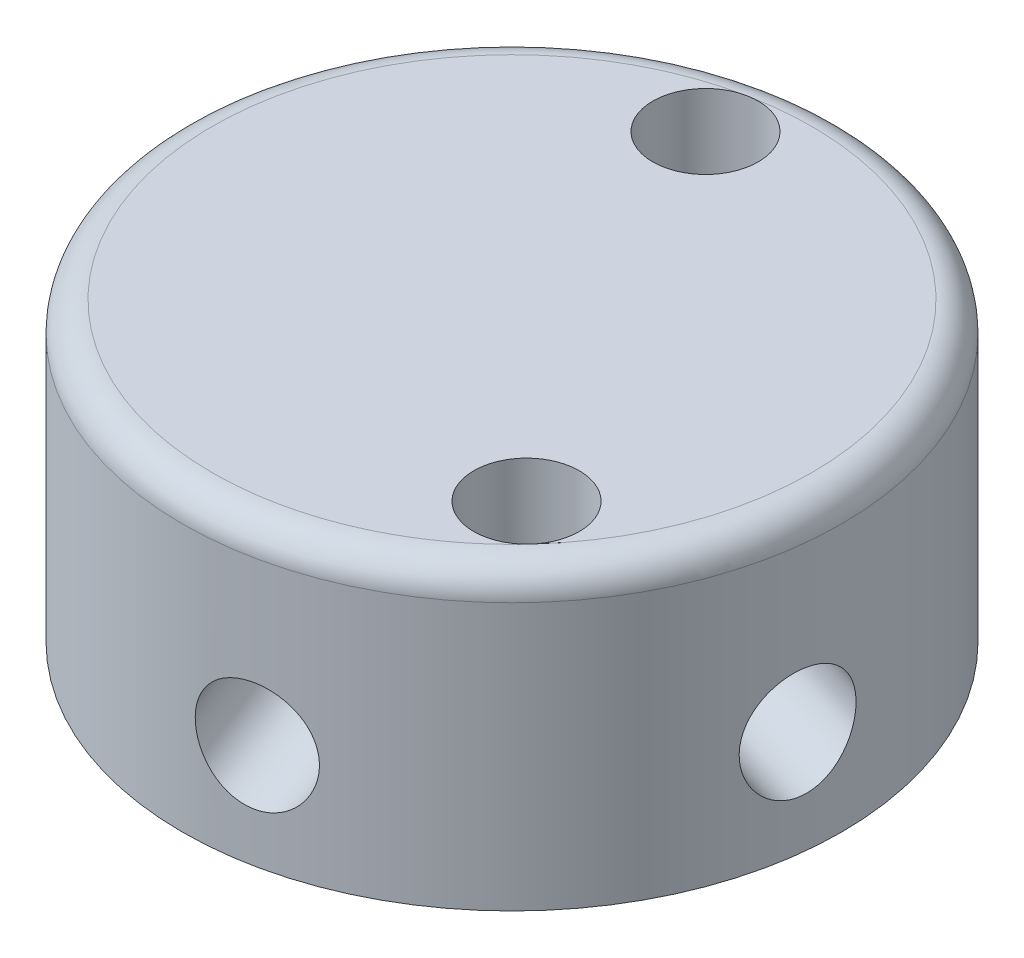
ISO-10303-21;
HEADER;
FILE_DESCRIPTION(('STEP AP214'),'2;1');
FILE_NAME('part.step','',(''),(''),'','','');
FILE_SCHEMA(('AUTOMOTIVE_DESIGN { 1 0 10303 214 1 1 1 1 }'));
ENDSEC;
DATA;
#1=APPLICATION_CONTEXT('core data for automotive mechanical design processes');
#2=APPLICATION_PROTOCOL_DEFINITION('international standard','automotive_design',2000,#1);
#3=PRODUCT_CONTEXT('',#1,'mechanical');
#4=PRODUCT('Part','Part','',(#3));
#5=PRODUCT_RELATED_PRODUCT_CATEGORY('part','',(#4));
#6=PRODUCT_DEFINITION_FORMATION('','',#4);
#7=PRODUCT_DEFINITION_CONTEXT('part definition',#1,'design');
#8=PRODUCT_DEFINITION('design','',#6,#7);
#9=PRODUCT_DEFINITION_SHAPE('','',#8);
#10=(LENGTH_UNIT() NAMED_UNIT(*) SI_UNIT(.MILLI.,.METRE.));
#11=(NAMED_UNIT(*) PLANE_ANGLE_UNIT() SI_UNIT($,.RADIAN.));
#12=(NAMED_UNIT(*) SI_UNIT($,.STERADIAN.) SOLID_ANGLE_UNIT());
#13=UNCERTAINTY_MEASURE_WITH_UNIT(LENGTH_MEASURE(1.E-05),#10,'distance_accuracy_value','');
#14=(GEOMETRIC_REPRESENTATION_CONTEXT(3) GLOBAL_UNCERTAINTY_ASSIGNED_CONTEXT((#13)) GLOBAL_UNIT_ASSIGNED_CONTEXT((#10,
#11,#12)) REPRESENTATION_CONTEXT('',''));
#15=CARTESIAN_POINT('',(0.,0.,0.));
#16=DIRECTION('',(0.,0.,1.));
#17=DIRECTION('',(1.,0.,0.));
#18=AXIS2_PLACEMENT_3D('',#15,#16,#17);
#19=CARTESIAN_POINT('',(0.,-6.,0.));
#20=DIRECTION('',(0.,1.,0.));
#21=DIRECTION('',(0.,0.,1.));
#22=AXIS2_PLACEMENT_3D('',#19,#20,#21);
#23=CYLINDRICAL_SURFACE('',#22,10.);
#24=CARTESIAN_POINT('',(0.,2.1,0.));
#25=DIRECTION('',(0.,1.,0.));
#26=DIRECTION('',(0.,0.,1.));
#27=AXIS2_PLACEMENT_3D('',#24,#25,#26);
#28=CIRCLE('',#27,10.);
#29=CARTESIAN_POINT('',(0.,2.1,10.));
#30=VERTEX_POINT('',#29);
#31=EDGE_CURVE('E12',#30,#30,#28,.F.);
#32=ORIENTED_EDGE('',*,*,#31,.T.);
#33=EDGE_LOOP('',(#32));
#34=FACE_BOUND('',#33,.T.);
#35=CARTESIAN_POINT('',(-6.18040658631982,-2.80419257592395,-7.8614613417465));
#36=CARTESIAN_POINT('',(-6.18041069378116,-2.90234784309518,-7.86145985033207));
#37=CARTESIAN_POINT('',(-6.18709037837394,-3.00057569421897,-7.85622071906424));
#38=CARTESIAN_POINT('',(-6.21328313433534,-3.19429375623175,-7.83552031582612));
#39=CARTESIAN_POINT('',(-6.23281569685475,-3.28977957900091,-7.82004351843738));
#40=CARTESIAN_POINT('',(-6.28376502842835,-3.47517276967888,-7.77916181257504));
#41=CARTESIAN_POINT('',(-6.31516706385408,-3.56508689335964,-7.75376921134334));
#42=CARTESIAN_POINT('',(-6.38865971296323,-3.73693258914234,-7.69332712533847));
#43=CARTESIAN_POINT('',(-6.4307480948599,-3.81886582307326,-7.65827965680337));
#44=CARTESIAN_POINT('',(-6.52448986893661,-3.97278415857681,-7.5785772815116));
#45=CARTESIAN_POINT('',(-6.57620342226979,-4.04470142029659,-7.53386164380033));
#46=CARTESIAN_POINT('',(-6.68725447470501,-4.17534392326118,-7.43546314485651));
#47=CARTESIAN_POINT('',(-6.74659001159406,-4.23407254914793,-7.38178259049963));
#48=CARTESIAN_POINT('',(-6.86747316238743,-4.33309816932697,-7.26940523116863));
#49=CARTESIAN_POINT('',(-6.92874101682425,-4.37420107240322,-7.21111983965897));
#50=CARTESIAN_POINT('',(-7.05399457373656,-4.44028699170343,-7.08863909005609));
#51=CARTESIAN_POINT('',(-7.1179783887015,-4.46528101377072,-7.02444780130276));
#52=CARTESIAN_POINT('',(-7.2408979989159,-4.4964619358335,-6.8975752553002));
#53=CARTESIAN_POINT('',(-7.2998114016746,-4.50403920222909,-6.835211852897));
#54=CARTESIAN_POINT('',(-7.41599656463583,-4.50415740699111,-6.70897494081218));
#55=CARTESIAN_POINT('',(-7.47326875792584,-4.49670234989006,-6.64510183778663));
#56=CARTESIAN_POINT('',(-7.58217917913624,-4.46774917979113,-6.52051620708892));
#57=CARTESIAN_POINT('',(-7.63395240425703,-4.44684381033082,-6.45978210248453));
#58=CARTESIAN_POINT('',(-7.73327325732892,-4.39246364343792,-6.34054506008151));
#59=CARTESIAN_POINT('',(-7.78082040703957,-4.35898742566933,-6.28204237522627));
#60=CARTESIAN_POINT('',(-7.87234067780815,-4.27943950635112,-6.1669959074082));
#61=CARTESIAN_POINT('',(-7.91614456968675,-4.23298937226029,-6.11058005058202));
#62=CARTESIAN_POINT('',(-7.99779809730484,-4.12962391405995,-6.00331398885442));
#63=CARTESIAN_POINT('',(-8.03564580230697,-4.0727052094075,-5.95246559029986));
#64=CARTESIAN_POINT('',(-8.10775604691805,-3.94529584290214,-5.85391396776607));
#65=CARTESIAN_POINT('',(-8.14151429694982,-3.87409566698231,-5.80675887231004));
#66=CARTESIAN_POINT('',(-8.20153607142322,-3.7234916320388,-5.72167140512811));
#67=CARTESIAN_POINT('',(-8.22779684344153,-3.64408477476704,-5.68374242118406));
#68=CARTESIAN_POINT('',(-8.27416487683236,-3.47360706993731,-5.61604816884507));
#69=CARTESIAN_POINT('',(-8.29374975039458,-3.38211206928312,-5.58698947660017));
#70=CARTESIAN_POINT('',(-8.32405447795391,-3.19457090082377,-5.54173833167562));
#71=CARTESIAN_POINT('',(-8.33477322064973,-3.09852416408824,-5.52554749189225));
#72=CARTESIAN_POINT('',(-8.34721005269621,-2.9032972349777,-5.50674303326532));
#73=CARTESIAN_POINT('',(-8.3488141503021,-2.80409289685924,-5.50430137103277));
#74=CARTESIAN_POINT('',(-8.34248086251898,-2.60668729118917,-5.51389588691072));
#75=CARTESIAN_POINT('',(-8.33454554272457,-2.50848581112888,-5.52592893077623));
#76=CARTESIAN_POINT('',(-8.30942286587974,-2.31961542955216,-5.56362998091201));
#77=CARTESIAN_POINT('',(-8.29257179549985,-2.22880300805648,-5.58880197157573));
#78=CARTESIAN_POINT('',(-8.24983112683427,-2.05390062311326,-5.65170093491985));
#79=CARTESIAN_POINT('',(-8.2239437144287,-1.96980903994349,-5.68942487119679));
#80=CARTESIAN_POINT('',(-8.16459239437144,-1.81433058777238,-5.77425211059514));
#81=CARTESIAN_POINT('',(-8.13148151790137,-1.74256485669541,-5.82090888833601));
#82=CARTESIAN_POINT('',(-8.05758249695944,-1.60987893076595,-5.92277904761302));
#83=CARTESIAN_POINT('',(-8.01679522194457,-1.54895750916636,-5.97799145998169));
#84=CARTESIAN_POINT('',(-7.9291356931972,-1.44084866104323,-6.09376440834493));
#85=CARTESIAN_POINT('',(-7.88240129647873,-1.39341115377824,-6.15419605110393));
#86=CARTESIAN_POINT('',(-7.78316118923601,-1.31197818446462,-6.27923276033472));
#87=CARTESIAN_POINT('',(-7.73065563818385,-1.27798235110665,-6.34383771146675));
#88=CARTESIAN_POINT('',(-7.62126393920933,-1.22444215000392,-6.47484261923763));
#89=CARTESIAN_POINT('',(-7.56439461267379,-1.20484509181928,-6.54123510023709));
#90=CARTESIAN_POINT('',(-7.44753128648001,-1.18040665367519,-6.67398645668238));
#91=CARTESIAN_POINT('',(-7.38753727259583,-1.17556534090098,-6.74034533197383));
#92=CARTESIAN_POINT('',(-7.26603697545491,-1.18076540289665,-6.87114840534427));
#93=CARTESIAN_POINT('',(-7.20452970867928,-1.1908167224365,-6.93559129467686));
#94=CARTESIAN_POINT('',(-7.08188582181877,-1.22556046932424,-7.06077720898353));
#95=CARTESIAN_POINT('',(-7.02074920150364,-1.25025288757539,-7.12152023625636));
#96=CARTESIAN_POINT('',(-6.90082161745449,-1.31362986693059,-7.23779262794899));
#97=CARTESIAN_POINT('',(-6.84203053304105,-1.3523137071329,-7.29332226080096));
#98=CARTESIAN_POINT('',(-6.72880950003165,-1.4426321301286,-7.39790984547475));
#99=CARTESIAN_POINT('',(-6.67437928718441,-1.49426592742231,-7.44696818954728));
#100=CARTESIAN_POINT('',(-6.57186287088399,-1.60901583583468,-7.53759282097776));
#101=CARTESIAN_POINT('',(-6.52377217819324,-1.67212374556233,-7.57916441768701));
#102=CARTESIAN_POINT('',(-6.43563400862007,-1.80807329481835,-7.65414747741365));
#103=CARTESIAN_POINT('',(-6.39558808462159,-1.88091680910276,-7.68755736524249));
#104=CARTESIAN_POINT('',(-6.32481099983414,-2.03460274266089,-7.74589484926247));
#105=CARTESIAN_POINT('',(-6.29412611305473,-2.11548235994557,-7.77078037939385));
#106=CARTESIAN_POINT('',(-6.24337632993539,-2.2825764910716,-7.8116145758641));
#107=CARTESIAN_POINT('',(-6.22330160238461,-2.36878598329015,-7.82757151610482));
#108=CARTESIAN_POINT('',(-6.19932412581324,-2.51357139572223,-7.84656075943516));
#109=CARTESIAN_POINT('',(-6.19222425836726,-2.57131759117338,-7.85215871739794));
#110=CARTESIAN_POINT('',(-6.18276429226737,-2.68743149130231,-7.85960943208847));
#111=CARTESIAN_POINT('',(-6.18040414275684,-2.74579918930468,-7.86146222900137));
#112=CARTESIAN_POINT('',(-6.18040658631982,-2.80419257592395,-7.8614613417465));
#113=B_SPLINE_CURVE_WITH_KNOTS('',3,(#35,#36,#37,#38,#39,#40,#41,#42,#43,#44,#45,#46,#47,#48,
#49,#50,#51,#52,#53,#54,#55,#56,#57,#58,#59,#60,#61,#62,#63,#64,#65,#66,#67,#68,#69,#70,#71,#72,
#73,#74,#75,#76,#77,#78,#79,#80,#81,#82,#83,#84,#85,#86,#87,#88,#89,#90,#91,#92,#93,#94,#95,#96,
#97,#98,#99,#100,#101,#102,#103,#104,#105,#106,#107,#108,#109,#110,#111,#112),.UNSPECIFIED.,.T.,
.F.,(4,2,2,2,2,2,2,2,2,2,2,2,2,2,2,2,2,2,2,2,2,2,2,2,2,2,2,2,2,2,2,2,2,2,2,2,2,2,4),(0.,
0.294247369480007,0.588941991186979,0.883272002128368,1.17754059429731,1.47371432417628,
1.76981195895846,2.05036159735739,2.33071935602934,2.58777759553048,2.84476736510533,
3.091142592679,3.33754566570429,3.59206194690359,3.84666056204866,4.12096676141902,
4.39537353311392,4.6879442991612,4.98055173114879,5.27681071896179,5.57300556860702,
5.85875072810492,6.1444268140438,6.41842323334606,6.69238863746758,6.9608803249332,
7.22936459513529,7.49686142113619,7.76435946509044,8.0320362152438,8.29971279908588,
8.56737559297647,8.83502215529133,9.10247815769814,9.36998573770895,9.63879501418435,
9.90735477750061,10.0824068686198,10.2574570814401),.UNSPECIFIED.);
#114=CARTESIAN_POINT('',(-6.18040658631982,-2.80419257592395,-7.8614613417465));
#115=VERTEX_POINT('',#114);
#116=EDGE_CURVE('E86',#115,#115,#113,.T.);
#117=ORIENTED_EDGE('',*,*,#116,.F.);
#118=EDGE_LOOP('',(#117));
#119=FACE_BOUND('',#118,.T.);
#120=CARTESIAN_POINT('',(5.56684336935079,-2.80419257592395,-8.30724111249428));
#121=CARTESIAN_POINT('',(5.56684068165602,-2.90234784309518,-8.30724455804975));
#122=CARTESIAN_POINT('',(5.5597938356678,-3.00057569421897,-8.31197833501099));
#123=CARTESIAN_POINT('',(5.53201257555666,-3.19429375623175,-8.33049234985681));
#124=CARTESIAN_POINT('',(5.51125737278652,-3.28977957900091,-8.34428632730922));
#125=CARTESIAN_POINT('',(5.4566323507206,-3.47517276967888,-8.38010887923268));
#126=CARTESIAN_POINT('',(5.42277878924899,-3.56508689335964,-8.40212724433727));
#127=CARTESIAN_POINT('',(5.34258447195922,-3.73693258914234,-8.45334527542134));
#128=CARTESIAN_POINT('',(5.29624632335746,-3.81886582307326,-8.48254344189732));
#129=CARTESIAN_POINT('',(5.19147705869946,-3.97278415857681,-8.54706777852483));
#130=CARTESIAN_POINT('',(5.13296959325439,-4.04470142029659,-8.58243239843604));
#131=CARTESIAN_POINT('',(5.0050703971945,-4.17534392326118,-8.65764141710136));
#132=CARTESIAN_POINT('',(4.93568146690598,-4.23407254914793,-8.69748466254382));
#133=CARTESIAN_POINT('',(4.79144929910144,-4.33309816932697,-8.77772485699988));
#134=CARTESIAN_POINT('',(4.7170837894715,-4.37420107240322,-8.81798287270117));
#135=CARTESIAN_POINT('',(4.56189219674915,-4.44028699170343,-8.89925745108069));
#136=CARTESIAN_POINT('',(4.48107056710181,-4.46528101377072,-8.94027347612491));
#137=CARTESIAN_POINT('',(4.32242335698893,-4.4964619358335,-9.01797119956537));
#138=CARTESIAN_POINT('',(4.24490699410614,-4.50403920222909,-9.05472982398652));
#139=CARTESIAN_POINT('',(4.08894536642164,-4.50415740699111,-9.12621912916599));
#140=CARTESIAN_POINT('',(4.01050035454146,-4.49670234989006,-9.16095034747861));
#141=CARTESIAN_POINT('',(3.85835720761111,-4.46774917979113,-9.2260312361227));
#142=CARTESIAN_POINT('',(3.78459683524983,-4.44684381033082,-9.25650262878254));
#143=CARTESIAN_POINT('',(3.64050383759365,-4.39246364343792,-9.31411610083902));
#144=CARTESIAN_POINT('',(3.57017160064663,-4.35898742566933,-9.34125780356576));
#145=CARTESIAN_POINT('',(3.43247458875423,-4.27943950635112,-9.39274743975472));
#146=CARTESIAN_POINT('',(3.36528377348706,-4.23298937226029,-9.41697395805344));
#147=CARTESIAN_POINT('',(3.23803535881906,-4.12962391405995,-9.46148404157961));
#148=CARTESIAN_POINT('',(3.17798007398682,-4.0727052094075,-9.48176632875859));
#149=CARTESIAN_POINT('',(3.06196862013124,-3.94529584290214,-9.51989312060143));
#150=CARTESIAN_POINT('',(3.00668958636109,-3.87409566698231,-9.53742739840558));
#151=CARTESIAN_POINT('',(2.90721884789784,-3.7234916320388,-9.56821802477057));
#152=CARTESIAN_POINT('',(2.86303121572234,-3.64408477476704,-9.58147280250344));
#153=CARTESIAN_POINT('',(2.78432164560611,-3.47360706993731,-9.60465274841332));
#154=CARTESIAN_POINT('',(2.75063312822817,-3.38211206928312,-9.61429944029751));
#155=CARTESIAN_POINT('',(2.69823205615212,-3.19457090082377,-9.62913757612075));
#156=CARTESIAN_POINT('',(2.67952137882051,-3.09852416408824,-9.63432846156183));
#157=CARTESIAN_POINT('',(2.65779408344942,-2.9032972349777,-9.64034569443597));
#158=CARTESIAN_POINT('',(2.6549762312517,-2.80409289685924,-9.64111676679244));
#159=CARTESIAN_POINT('',(2.66605825165337,-2.60668729118918,-9.63805832063582));
#160=CARTESIAN_POINT('',(2.67995450510481,-2.50848581112888,-9.63422979808496));
#161=CARTESIAN_POINT('',(2.72357366859686,-2.31961542955216,-9.62198697776265));
#162=CARTESIAN_POINT('',(2.7527209214665,-2.22880300805648,-9.61373923036864));
#163=CARTESIAN_POINT('',(2.82574898339175,-2.05390062311326,-9.59252728752533));
#164=CARTESIAN_POINT('',(2.86962622918195,-1.96980903994349,-9.57956423267128));
#165=CARTESIAN_POINT('',(2.96864229450736,-1.81433058777238,-9.54933083154011));
#166=CARTESIAN_POINT('',(3.02324735053505,-1.74256485669541,-9.5322582539377));
#167=CARTESIAN_POINT('',(3.1429676826702,-1.60987893076595,-9.49345571895933));
#168=CARTESIAN_POINT('',(3.20808176836764,-1.54895750916636,-9.47172628899688));
#169=CARTESIAN_POINT('',(3.34527666942103,-1.44084866104323,-9.42413293149946));
#170=CARTESIAN_POINT('',(3.41719229986527,-1.39341115377824,-9.39836028357576));
#171=CARTESIAN_POINT('',(3.56677615661691,-1.31197818446462,-9.34261580097778));
#172=CARTESIAN_POINT('',(3.64444422395009,-1.27798235110665,-9.31264408232851));
#173=CARTESIAN_POINT('',(3.80284118917892,-1.22444215000392,-9.24908913703792));
#174=CARTESIAN_POINT('',(3.88355777922459,-1.20484509181928,-9.21551959838653));
#175=CARTESIAN_POINT('',(4.04592457563197,-1.18040665367519,-9.14539839566193));
#176=CARTESIAN_POINT('',(4.12757478624289,-1.17556534090098,-9.10884671801134));
#177=CARTESIAN_POINT('',(4.28952155816144,-1.18076540289665,-9.03371344127161));
#178=CARTESIAN_POINT('',(4.36981717870131,-1.1908167224365,-8.99513050237554));
#179=CARTESIAN_POINT('',(4.52677510354713,-1.22556046932424,-8.91717380957021));
#180=CARTESIAN_POINT('',(4.60343741011047,-1.25025288757539,-8.87780005615232));
#181=CARTESIAN_POINT('',(4.75107868746049,-1.31362986693059,-8.79967229086849));
#182=CARTESIAN_POINT('',(4.82205795083332,-1.3523137071329,-8.76091824717969));
#183=CARTESIAN_POINT('',(4.95651387808148,-1.4426321301286,-8.68555798701926));
#184=CARTESIAN_POINT('',(5.01999099666755,-1.49426592742231,-8.64895164044187));
#185=CARTESIAN_POINT('',(5.1378594577656,-1.60901583583468,-8.57945728591311));
#186=CARTESIAN_POINT('',(5.19225723702143,-1.67212374556233,-8.54656664912289));
#187=CARTESIAN_POINT('',(5.29080655683742,-1.80807329481835,-8.48591330836175));
#188=CARTESIAN_POINT('',(5.3349561194367,-1.88091680910276,-8.45815159451121));
#189=CARTESIAN_POINT('',(5.41230968576981,-2.03460274266089,-8.40886586079098));
#190=CARTESIAN_POINT('',(5.44545938284803,-2.11548235994557,-8.38737285099227));
#191=CARTESIAN_POINT('',(5.49997755693345,-2.2825764910716,-8.35172539971701));
#192=CARTESIAN_POINT('',(5.52135694090016,-2.36878598329015,-8.3375641649796));
#193=CARTESIAN_POINT('',(5.54682623225177,-2.51357139572223,-8.32062822854148));
#194=CARTESIAN_POINT('',(5.55434418634884,-2.57131759117338,-8.31560571748645));
#195=CARTESIAN_POINT('',(5.5643535273974,-2.68743149130231,-8.30891115254283));
#196=CARTESIAN_POINT('',(5.56684496828281,-2.74579918930467,-8.30723906270461));
#197=CARTESIAN_POINT('',(5.56684336935079,-2.80419257592395,-8.30724111249428));
#198=B_SPLINE_CURVE_WITH_KNOTS('',3,(#120,#121,#122,#123,#124,#125,#126,#127,#128,#129,#130,
#131,#132,#133,#134,#135,#136,#137,#138,#139,#140,#141,#142,#143,#144,#145,#146,#147,#148,#149,
#150,#151,#152,#153,#154,#155,#156,#157,#158,#159,#160,#161,#162,#163,#164,#165,#166,#167,#168,
#169,#170,#171,#172,#173,#174,#175,#176,#177,#178,#179,#180,#181,#182,#183,#184,#185,#186,#187,
#188,#189,#190,#191,#192,#193,#194,#195,#196,#197),.UNSPECIFIED.,.T.,.F.,(4,2,2,2,2,2,2,2,2,2,2,
2,2,2,2,2,2,2,2,2,2,2,2,2,2,2,2,2,2,2,2,2,2,2,2,2,2,2,4),(0.,0.294247369480007,
0.588941991186979,0.883272002128369,1.17754059429731,1.47371432417628,1.76981195895846,
2.05036159735739,2.33071935602934,2.58777759553048,2.84476736510533,3.091142592679,
3.33754566570429,3.59206194690359,3.84666056204865,4.12096676141902,4.39537353311392,
4.6879442991612,4.98055173114879,5.27681071896179,5.57300556860702,5.85875072810493,
6.1444268140438,6.41842323334606,6.69238863746758,6.9608803249332,7.22936459513529,
7.49686142113619,7.76435946509044,8.0320362152438,8.29971279908588,8.56737559297647,
8.83502215529133,9.10247815769814,9.36998573770895,9.63879501418435,9.90735477750061,
10.0824068686198,10.2574570814401),.UNSPECIFIED.);
#199=CARTESIAN_POINT('',(5.56684336935079,-2.80419257592395,-8.30724111249428));
#200=VERTEX_POINT('',#199);
#201=EDGE_CURVE('E162',#200,#200,#198,.T.);
#202=ORIENTED_EDGE('',*,*,#201,.F.);
#203=EDGE_LOOP('',(#202));
#204=FACE_BOUND('',#203,.T.);
#205=CARTESIAN_POINT('',(9.92735308998561,-4.50322630338943,1.20318769390029));
#206=CARTESIAN_POINT('',(9.93747158086751,-4.50611583843854,1.11968976236709));
#207=CARTESIAN_POINT('',(9.94656365977674,-4.50178304837939,1.03576684298313));
#208=CARTESIAN_POINT('',(9.9624661113616,-4.47884815399744,0.869629076678414));
#209=CARTESIAN_POINT('',(9.96927428677865,-4.46023236479396,0.787415945583453));
#210=CARTESIAN_POINT('',(9.98062867071901,-4.40963627823444,0.627282609305299));
#211=CARTESIAN_POINT('',(9.98518021682377,-4.37768784959331,0.549352665483974));
#212=CARTESIAN_POINT('',(9.99229678886943,-4.30173146568903,0.399548007862778));
#213=CARTESIAN_POINT('',(9.99486174569541,-4.25772309092354,0.327673504813696));
#214=CARTESIAN_POINT('',(9.99846782325065,-4.15722061048359,0.188834448148186));
#215=CARTESIAN_POINT('',(9.99944461795647,-4.10030129130652,0.122176792796474));
#216=CARTESIAN_POINT('',(10.000191736081,-3.97687044676209,-0.00157118390889282));
#217=CARTESIAN_POINT('',(9.99996165377224,-3.91035570291724,-0.0586582811790618));
#218=CARTESIAN_POINT('',(9.99877298805763,-3.76384268192975,-0.166355199607757));
#219=CARTESIAN_POINT('',(9.99775735406143,-3.68319042631406,-0.216075988456209));
#220=CARTESIAN_POINT('',(9.99553162089881,-3.51496774271233,-0.301993473386273));
#221=CARTESIAN_POINT('',(9.994321459765,-3.42739511474905,-0.338185847680939));
#222=CARTESIAN_POINT('',(9.99214475836298,-3.24336619318965,-0.397457240081453));
#223=CARTESIAN_POINT('',(9.99119221933799,-3.1466860486199,-0.419845630271941));
#224=CARTESIAN_POINT('',(9.98997443116463,-2.95091352349595,-0.447898162480002));
#225=CARTESIAN_POINT('',(9.98970915334956,-2.85182124372955,-0.453563002063254));
#226=CARTESIAN_POINT('',(9.98997568776477,-2.65525702638746,-0.447654862845942));
#227=CARTESIAN_POINT('',(9.99049850373749,-2.55777945013346,-0.436276445782735));
#228=CARTESIAN_POINT('',(9.99215335482241,-2.36634287483814,-0.396564915311679));
#229=CARTESIAN_POINT('',(9.99328522731719,-2.27238294374863,-0.368236327354412));
#230=CARTESIAN_POINT('',(9.99565636177197,-2.09496299673918,-0.29675815295416));
#231=CARTESIAN_POINT('',(9.99688892730428,-2.01122538412609,-0.254297055812373));
#232=CARTESIAN_POINT('',(9.99891334558655,-1.85241205398823,-0.15544858565793));
#233=CARTESIAN_POINT('',(9.99970528156228,-1.77733470284466,-0.0990638454394953));
#234=CARTESIAN_POINT('',(10.0001535387467,-1.64051789357053,0.0238823714026653));
#235=CARTESIAN_POINT('',(9.99984675535424,-1.57841786272032,0.0900429836730085));
#236=CARTESIAN_POINT('',(9.99756202838942,-1.46630729881969,0.23189170496111));
#237=CARTESIAN_POINT('',(9.99558420163241,-1.4162959210183,0.307579147684775));
#238=CARTESIAN_POINT('',(9.9894764346614,-1.33027339058666,0.465306593080012));
#239=CARTESIAN_POINT('',(9.98537168516191,-1.2941067981997,0.547262868864093));
#240=CARTESIAN_POINT('',(9.97469882670128,-1.23592461440921,0.715901872032833));
#241=CARTESIAN_POINT('',(9.96813073798167,-1.21390890673034,0.802584560575034));
#242=CARTESIAN_POINT('',(9.95243946460123,-1.18461552438532,0.978112721952867));
#243=CARTESIAN_POINT('',(9.94331817823612,-1.17732693310918,1.0669565433517));
#244=CARTESIAN_POINT('',(9.92268067853598,-1.17764248148586,1.24433950491424));
#245=CARTESIAN_POINT('',(9.9111644558854,-1.18524667906793,1.33287864389147));
#246=CARTESIAN_POINT('',(9.88615666531998,-1.21516102778183,1.50720523339001));
#247=CARTESIAN_POINT('',(9.87266392129036,-1.23747996268658,1.59299100823057));
#248=CARTESIAN_POINT('',(9.8443798474004,-1.29624869601392,1.75934922279337));
#249=CARTESIAN_POINT('',(9.82958853329444,-1.33269832301985,1.83992172574296));
#250=CARTESIAN_POINT('',(9.79958146819504,-1.41872943258444,1.99357342171471));
#251=CARTESIAN_POINT('',(9.78436595790433,-1.46830359828222,2.06665675851568));
#252=CARTESIAN_POINT('',(9.75448615573963,-1.57922779388592,2.20338517182545));
#253=CARTESIAN_POINT('',(9.73982184666737,-1.64057745601468,2.26703054299466));
#254=CARTESIAN_POINT('',(9.71204281917471,-1.77334593453038,2.3832340763728));
#255=CARTESIAN_POINT('',(9.69892869479173,-1.84476858808605,2.43578799430921));
#256=CARTESIAN_POINT('',(9.67517431857508,-1.99561388433194,2.52849769883648));
#257=CARTESIAN_POINT('',(9.66453409775658,-2.07503662730087,2.5686533299929));
#258=CARTESIAN_POINT('',(9.64636774595636,-2.24043354768507,2.63606282413499));
#259=CARTESIAN_POINT('',(9.63887350834762,-2.32646483157541,2.66318493730356));
#260=CARTESIAN_POINT('',(9.62763461524281,-2.50195468590873,2.7035333093719));
#261=CARTESIAN_POINT('',(9.62389048520026,-2.59141373481684,2.71675762096731));
#262=CARTESIAN_POINT('',(9.62028554157676,-2.77404457649806,2.72949698535217));
#263=CARTESIAN_POINT('',(9.62054338150975,-2.86724772045195,2.72859315038128));
#264=CARTESIAN_POINT('',(9.62512160451679,-3.05229313121454,2.71239749907065));
#265=CARTESIAN_POINT('',(9.62944296169443,-3.14413506635284,2.69710223282622));
#266=CARTESIAN_POINT('',(9.64203841119566,-3.32803733023408,2.65173003156967));
#267=CARTESIAN_POINT('',(9.65047469065912,-3.41993678405649,2.62104497712594));
#268=CARTESIAN_POINT('',(9.67069145979926,-3.59730393228497,2.54543724825957));
#269=CARTESIAN_POINT('',(9.68247270396796,-3.68277017010274,2.50051136140061));
#270=CARTESIAN_POINT('',(9.70881886923832,-3.84670132949995,2.39620308017121));
#271=CARTESIAN_POINT('',(9.72344054533483,-3.92496503751464,2.33651768067541));
#272=CARTESIAN_POINT('',(9.75422250490331,-4.06967581198045,2.20447803636209));
#273=CARTESIAN_POINT('',(9.77038291520708,-4.13612190305521,2.13212274680237));
#274=CARTESIAN_POINT('',(9.80248646043133,-4.25247409998337,1.97917783489853));
#275=CARTESIAN_POINT('',(9.81841739257082,-4.3028778508246,1.8989652082616));
#276=CARTESIAN_POINT('',(9.84949876089979,-4.38788221630196,1.73050781058989));
#277=CARTESIAN_POINT('',(9.8646505948503,-4.42251207536418,1.64227827016818));
#278=CARTESIAN_POINT('',(9.88779604627379,-4.46447792520214,1.49492175671137));
#279=CARTESIAN_POINT('',(9.89633516158305,-4.47718169552662,1.43735988808217));
#280=CARTESIAN_POINT('',(9.91253806276659,-4.49553453526019,1.32099860608937));
#281=CARTESIAN_POINT('',(9.92020191554303,-4.50118414419441,1.26219928771976));
#282=CARTESIAN_POINT('',(9.92735308998561,-4.50322630338943,1.20318769390029));
#283=B_SPLINE_CURVE_WITH_KNOTS('',3,(#205,#206,#207,#208,#209,#210,#211,#212,#213,#214,#215,
#216,#217,#218,#219,#220,#221,#222,#223,#224,#225,#226,#227,#228,#229,#230,#231,#232,#233,#234,
#235,#236,#237,#238,#239,#240,#241,#242,#243,#244,#245,#246,#247,#248,#249,#250,#251,#252,#253,
#254,#255,#256,#257,#258,#259,#260,#261,#262,#263,#264,#265,#266,#267,#268,#269,#270,#271,#272,
#273,#274,#275,#276,#277,#278,#279,#280,#281,#282),.UNSPECIFIED.,.T.,.F.,(4,2,2,2,2,2,2,2,2,2,2,
2,2,2,2,2,2,2,2,2,2,2,2,2,2,2,2,2,2,2,2,2,2,2,2,2,2,2,4),(0.,0.252248403203044,0.50473879386721,
0.756629088117827,1.00852814542465,1.27039654907248,1.53235299318959,1.8153580038218,
2.09845334611585,2.39475726963461,2.69104883367463,2.98398368367868,3.27684035918863,
3.55712444850328,3.83735557997979,4.10826598771179,4.37915745884014,4.6469115111212,
4.9146633632858,5.18221666901757,5.44977101546732,5.71748521982135,5.98519617668867,
6.25275819925242,6.5203118665682,6.78796773148794,7.05562695181105,7.325937691841,
7.59628630168278,7.87466534218203,8.15311113253284,8.44354639949903,8.73404722931547,
9.03109548314861,9.32816824272804,9.6148399080652,9.9009779057113,10.0792663817537,
10.2575412208797),.UNSPECIFIED.);
#284=CARTESIAN_POINT('',(9.92735308998561,-4.50322630338943,1.20318769390029));
#285=VERTEX_POINT('',#284);
#286=EDGE_CURVE('E171',#285,#285,#283,.T.);
#287=ORIENTED_EDGE('',*,*,#286,.F.);
#288=EDGE_LOOP('',(#287));
#289=FACE_BOUND('',#288,.T.);
#290=CARTESIAN_POINT('',(1.8869488312424,-1.17988271041713,9.820357636475));
#291=CARTESIAN_POINT('',(1.79945112973037,-1.18475788519567,9.83716851436081));
#292=CARTESIAN_POINT('',(1.71207388780583,-1.1970615964251,9.85273427537302));
#293=CARTESIAN_POINT('',(1.54011446951967,-1.23623501154644,9.88107607464319));
#294=CARTESIAN_POINT('',(1.45553513038818,-1.26311904764654,9.8938493505731));
#295=CARTESIAN_POINT('',(1.29172968985668,-1.33074121411888,9.91656548624668));
#296=CARTESIAN_POINT('',(1.21250170286714,-1.37147443377837,9.92650934696596));
#297=CARTESIAN_POINT('',(1.06173684355278,-1.46568816415508,9.94376591611577));
#298=CARTESIAN_POINT('',(0.990198215564106,-1.51916575601907,9.95107922606232));
#299=CARTESIAN_POINT('',(0.856928562793338,-1.63736917986167,9.96344117134831));
#300=CARTESIAN_POINT('',(0.795194342733254,-1.70209133275477,9.96849054549149));
#301=CARTESIAN_POINT('',(0.68328916963773,-1.84095631188058,9.97678675316516));
#302=CARTESIAN_POINT('',(0.633118430497758,-1.91509931233605,9.98003355335411));
#303=CARTESIAN_POINT('',(0.545463334213141,-2.07109010181131,9.98520987540477));
#304=CARTESIAN_POINT('',(0.508047312370339,-2.15297648026065,9.98713235637642));
#305=CARTESIAN_POINT('',(0.447138725622041,-2.32178014588872,9.99004511315271));
#306=CARTESIAN_POINT('',(0.423647416805992,-2.40869788614929,9.99103530486424));
#307=CARTESIAN_POINT('',(0.390591417550573,-2.58715311039519,9.99238320734883));
#308=CARTESIAN_POINT('',(0.381350410993514,-2.67875046191643,9.9927262563929));
#309=CARTESIAN_POINT('',(0.377720989293566,-2.86223482854569,9.99286381786895));
#310=CARTESIAN_POINT('',(0.383335721731672,-2.95412190091889,9.99265821405422));
#311=CARTESIAN_POINT('',(0.409498262249908,-3.13958461146535,9.99162097134035));
#312=CARTESIAN_POINT('',(0.430648645751802,-3.23307511652322,9.9907640208221));
#313=CARTESIAN_POINT('',(0.487770991347369,-3.41541140782257,9.98813748471376));
#314=CARTESIAN_POINT('',(0.523746946708113,-3.50425593539916,9.98636765320688));
#315=CARTESIAN_POINT('',(0.61102164830908,-3.67793018914257,9.98141395066469));
#316=CARTESIAN_POINT('',(0.662807753092569,-3.76251443694909,9.97818324657079));
#317=CARTESIAN_POINT('',(0.779887302249498,-3.92167683340661,9.96971466213185));
#318=CARTESIAN_POINT('',(0.845181587810698,-3.99625435843725,9.96447665676988));
#319=CARTESIAN_POINT('',(0.986696434114059,-4.13189888314325,9.95145224670999));
#320=CARTESIAN_POINT('',(1.06275908429531,-4.19313332764407,9.94370088320829));
#321=CARTESIAN_POINT('',(1.22439088781583,-4.30081455654523,9.92509236242018));
#322=CARTESIAN_POINT('',(1.30995475224262,-4.34726951292676,9.91423692778642));
#323=CARTESIAN_POINT('',(1.48149520274686,-4.42039515155083,9.89000123370738));
#324=CARTESIAN_POINT('',(1.56700117290235,-4.44824673456581,9.87685818054688));
#325=CARTESIAN_POINT('',(1.74117212114859,-4.48785940730089,9.8476440814622));
#326=CARTESIAN_POINT('',(1.82983527128239,-4.49962965729237,9.83157470834974));
#327=CARTESIAN_POINT('',(2.00061640842381,-4.50620850746607,9.79819054534492));
#328=CARTESIAN_POINT('',(2.08272613451838,-4.50222396319129,9.78105977801961));
#329=CARTESIAN_POINT('',(2.24465436031334,-4.48016765933825,9.7451732958157));
#330=CARTESIAN_POINT('',(2.3244730679195,-4.46209718225012,9.72641772900934));
#331=CARTESIAN_POINT('',(2.4786521356151,-4.41300188845494,9.68826715227286));
#332=CARTESIAN_POINT('',(2.55306887208699,-4.38214423029697,9.66888326539049));
#333=CARTESIAN_POINT('',(2.69584433373164,-4.30871265039763,9.63005220169523));
#334=CARTESIAN_POINT('',(2.7642017989999,-4.26613629950782,9.61060501258733));
#335=CARTESIAN_POINT('',(2.89714975163433,-4.16803837314638,9.57139471127444));
#336=CARTESIAN_POINT('',(2.96131666972515,-4.11192663970629,9.55167460859289));
#337=CARTESIAN_POINT('',(3.08028130015328,-3.99002612270598,9.51397759575605));
#338=CARTESIAN_POINT('',(3.13507556550246,-3.92423379538252,9.49600132797994));
#339=CARTESIAN_POINT('',(3.23839582013824,-3.77916184450483,9.46128964444992));
#340=CARTESIAN_POINT('',(3.28607166204278,-3.69922470291531,9.4447679979217));
#341=CARTESIAN_POINT('',(3.36861333681781,-3.53231996698333,9.41564471149395));
#342=CARTESIAN_POINT('',(3.40347519681208,-3.44535020240932,9.40304428752458));
#343=CARTESIAN_POINT('',(3.46100545316147,-3.26225642729358,9.38202713505441));
#344=CARTESIAN_POINT('',(3.48300099583673,-3.16589303513736,9.37384277009261));
#345=CARTESIAN_POINT('',(3.51136017725102,-2.97057074708831,9.36325710649527));
#346=CARTESIAN_POINT('',(3.51772416167656,-2.87161190864178,9.36085567997208));
#347=CARTESIAN_POINT('',(3.51433178540988,-2.6749381347884,9.36212990295936));
#348=CARTESIAN_POINT('',(3.50472924620439,-2.57722036376153,9.36574756478833));
#349=CARTESIAN_POINT('',(3.46954388654891,-2.38510669647371,9.37883870164833));
#350=CARTESIAN_POINT('',(3.44396531298001,-2.29070992443957,9.38831062044557));
#351=CARTESIAN_POINT('',(3.37861378028614,-2.1122239181654,9.41201963799943));
#352=CARTESIAN_POINT('',(3.33949209244676,-2.02786686659047,9.42603649247039));
#353=CARTESIAN_POINT('',(3.24775543901786,-1.86767474776899,9.45803536700821));
#354=CARTESIAN_POINT('',(3.19514350676156,-1.79183777025694,9.47601649556559));
#355=CARTESIAN_POINT('',(3.07977465382465,-1.65347380868961,9.51412324241499));
#356=CARTESIAN_POINT('',(3.01742430032603,-1.59058146667273,9.53415496109062));
#357=CARTESIAN_POINT('',(2.88299644381022,-1.47678152203921,9.57566018822197));
#358=CARTESIAN_POINT('',(2.81091766961876,-1.42587548801578,9.5971338849107));
#359=CARTESIAN_POINT('',(2.6599187612638,-1.33802625594269,9.64006834607164));
#360=CARTESIAN_POINT('',(2.58108928316139,-1.30092554630175,9.66152627940089));
#361=CARTESIAN_POINT('',(2.41807071745498,-1.24086915211944,9.70360732041632));
#362=CARTESIAN_POINT('',(2.33388706771279,-1.21789936112565,9.72423124138736));
#363=CARTESIAN_POINT('',(2.18892071746701,-1.19146477335558,9.75768152617976));
#364=CARTESIAN_POINT('',(2.12890975904827,-1.18417271969729,9.77095423583315));
#365=CARTESIAN_POINT('',(2.00822954382959,-1.17669311347785,9.79646967199437));
#366=CARTESIAN_POINT('',(1.94756028556266,-1.17650557675206,9.8087123962064));
#367=CARTESIAN_POINT('',(1.8869488312424,-1.17988271041713,9.820357636475));
#368=B_SPLINE_CURVE_WITH_KNOTS('',3,(#290,#291,#292,#293,#294,#295,#296,#297,#298,#299,#300,
#301,#302,#303,#304,#305,#306,#307,#308,#309,#310,#311,#312,#313,#314,#315,#316,#317,#318,#319,
#320,#321,#322,#323,#324,#325,#326,#327,#328,#329,#330,#331,#332,#333,#334,#335,#336,#337,#338,
#339,#340,#341,#342,#343,#344,#345,#346,#347,#348,#349,#350,#351,#352,#353,#354,#355,#356,#357,
#358,#359,#360,#361,#362,#363,#364,#365,#366,#367),.UNSPECIFIED.,.T.,.F.,(4,2,2,2,2,2,2,2,2,2,2,
2,2,2,2,2,2,2,2,2,2,2,2,2,2,2,2,2,2,2,2,2,2,2,2,2,2,2,4),(0.,0.267469811619867,
0.535203019253906,0.802841391544759,1.07041852522662,1.33790827518966,1.60540297264682,
1.87430908120209,2.14323944294974,2.41819277890536,2.69320437565799,2.97948684341757,
3.26584647179837,3.56211992190501,3.85841182724718,4.15073869864069,4.4429036524975,
4.71409391774852,4.98512964272775,5.23582093139192,5.48648939788596,5.73397953571808,
5.98152101405834,6.24288684630809,6.50434859557287,6.78669252311201,7.06912391551495,
7.36524356240143,7.6613566606451,7.95463350173544,8.24783241472102,8.52853798326313,
8.80918048934631,9.08026442131184,9.35138380909724,9.61930742364079,9.88696314259754,
10.0722445597595,10.2575263898977),.UNSPECIFIED.);
#369=CARTESIAN_POINT('',(1.8869488312424,-1.17988271041713,9.820357636475));
#370=VERTEX_POINT('',#369);
#371=EDGE_CURVE('E73',#370,#370,#368,.T.);
#372=ORIENTED_EDGE('',*,*,#371,.F.);
#373=EDGE_LOOP('',(#372));
#374=FACE_BOUND('',#373,.T.);
#375=CARTESIAN_POINT('',(-9.38654470399012,-2.80419257592395,3.44859080205164));
#376=CARTESIAN_POINT('',(-9.38654455484606,-2.90234784309518,3.44859516935191));
#377=CARTESIAN_POINT('',(-9.38362598097031,-3.00057569421897,3.45656690750819));
#378=CARTESIAN_POINT('',(-9.37203273430235,-3.19429375623175,3.487874475136));
#379=CARTESIAN_POINT('',(-9.36334931905659,-3.28977957900091,3.51123363941165));
#380=CARTESIAN_POINT('',(-9.34021271560724,-3.47517276967888,3.57232247507611));
#381=CARTESIAN_POINT('',(-9.32576667934466,-3.56508689335964,3.61003433080466));
#382=CARTESIAN_POINT('',(-9.29099331712761,-3.73693258914234,3.69860762539069));
#383=CARTESIAN_POINT('',(-9.27066721906947,-3.81886582307326,3.74946631864099));
#384=CARTESIAN_POINT('',(-9.22383355695659,-3.97278415857681,3.86324943218292));
#385=CARTESIAN_POINT('',(-9.19728682515046,-4.04470142029659,3.92624983602832));
#386=CARTESIAN_POINT('',(-9.13802095398199,-4.17534392326119,4.0622724714829));
#387=CARTESIAN_POINT('',(-9.10530340223162,-4.23407254914793,4.13529212405285));
#388=CARTESIAN_POINT('',(-9.03578113028456,-4.33309816932697,4.28498534614143));
#389=CARTESIAN_POINT('',(-8.99928123711436,-4.37420107240322,4.36126571484327));
#390=CARTESIAN_POINT('',(-8.92150059977564,-4.44028699170343,4.51823755944494));
#391=CARTESIAN_POINT('',(-8.88022314250651,-4.46528101377073,4.59892598272038));
#392=CARTESIAN_POINT('',(-8.79754442939001,-4.4964619358335,4.75503525182965));
#393=CARTESIAN_POINT('',(-8.75643855180501,-4.5040392022291,4.83033657859006));
#394=CARTESIAN_POINT('',(-8.672283303819,-4.50415740699111,4.97984458607279));
#395=CARTESIAN_POINT('',(-8.6292344540023,-4.49670234989006,5.05405155302212));
#396=CARTESIAN_POINT('',(-8.54440164910905,-4.46774917979113,5.19613059594724));
#397=CARTESIAN_POINT('',(-8.50263888957961,-4.44684381033082,5.26413772952888));
#398=CARTESIAN_POINT('',(-8.41992955491349,-4.39246364343792,5.39544374650843));
#399=CARTESIAN_POINT('',(-8.37898307255584,-4.35898742566933,5.45874209690884));
#400=CARTESIAN_POINT('',(-8.29784869865801,-4.27943950635112,5.58133436049499));
#401=CARTESIAN_POINT('',(-8.25773017741134,-4.23298937226029,5.64042779581673));
#402=CARTESIAN_POINT('',(-8.18094641811264,-4.12962391405996,5.7512319513299));
#403=CARTESIAN_POINT('',(-8.1442823013679,-4.0727052094075,5.80294027708911));
#404=CARTESIAN_POINT('',(-8.07283742961904,-3.94529584290214,5.90197532130427));
#405=CARTESIAN_POINT('',(-8.03842214176924,-3.87409566698231,5.948653050843));
#406=CARTESIAN_POINT('',(-7.97604689999563,-3.7234916320388,6.03203062394306));
#407=CARTESIAN_POINT('',(-7.94808931749826,-3.64408477476704,6.0687268029121));
#408=CARTESIAN_POINT('',(-7.89803676800905,-3.47360706993731,6.13374409761049));
#409=CARTESIAN_POINT('',(-7.87645236815793,-3.38211206928312,6.16135004897064));
#410=CARTESIAN_POINT('',(-7.84278064773336,-3.19457090082377,6.20415493038711));
#411=CARTESIAN_POINT('',(-7.83069451770443,-3.09852416408824,6.21935230512072));
#412=CARTESIAN_POINT('',(-7.81665360725043,-2.9032972349777,6.23699133256634));
#413=CARTESIAN_POINT('',(-7.81482714189443,-2.80409289685925,6.23927143517157));
#414=CARTESIAN_POINT('',(-7.8219949751856,-2.60668729118918,6.23028325209678));
#415=CARTESIAN_POINT('',(-7.83098693129249,-2.50848581112889,6.21901789944892));
#416=CARTESIAN_POINT('',(-7.85907942660605,-2.31961542955216,6.18347454873112));
#417=CARTESIAN_POINT('',(-7.8778121452341,-2.22880300805648,6.15966965554244));
#418=CARTESIAN_POINT('',(-7.92442502122213,-2.05390062311326,6.09958401549534));
#419=CARTESIAN_POINT('',(-7.9523029662649,-1.96980903994349,6.0633062858327));
#420=CARTESIAN_POINT('',(-8.01463789851775,-1.81433058777238,5.98064676758153));
#421=CARTESIAN_POINT('',(-8.04877930748964,-1.74256485669541,5.93473871552971));
#422=CARTESIAN_POINT('',(-8.12282753294734,-1.60987893076595,5.83297695967879));
#423=CARTESIAN_POINT('',(-8.1627336963771,-1.54895750916636,5.77712438227162));
#424=CARTESIAN_POINT('',(-8.24575202922682,-1.44084866104323,5.65797940770794));
#425=CARTESIAN_POINT('',(-8.28878421405532,-1.39341115377824,5.59485795056319));
#426=CARTESIAN_POINT('',(-8.37703431148377,-1.31197818446462,5.46183653181914));
#427=CARTESIAN_POINT('',(-8.42225216366868,-1.27798235110665,5.39193675752875));
#428=CARTESIAN_POINT('',(-8.51304134084415,-1.22444215000392,5.2474163265427));
#429=CARTESIAN_POINT('',(-8.55861075417355,-1.20484509181928,5.17281397803622));
#430=CARTESIAN_POINT('',(-8.6487520429548,-1.18040665367519,5.02064792497577));
#431=CARTESIAN_POINT('',(-8.69332391386377,-1.17556534090098,4.94308420693986));
#432=CARTESIAN_POINT('',(-8.78017937250602,-1.18076540289665,4.78711018502425));
#433=CARTESIAN_POINT('',(-8.82246141162344,-1.1908167224365,4.70869935018739));
#434=CARTESIAN_POINT('',(-8.90362124587707,-1.22556046932424,4.55337350742781));
#435=CARTESIAN_POINT('',(-8.94249904312836,-1.25025288757539,4.47645849857575));
#436=CARTESIAN_POINT('',(-9.01602099734735,-1.31362986693059,4.32647044327263));
#437=CARTESIAN_POINT('',(-9.05066537231721,-1.3523137071329,4.25339719909851));
#438=CARTESIAN_POINT('',(-9.11514685292419,-1.4426321301286,4.11339825680843));
#439=CARTESIAN_POINT('',(-9.14498424995578,-1.49426592742231,4.04647218616243));
#440=CARTESIAN_POINT('',(-9.19949408137533,-1.60901583583468,3.9209687291917));
#441=CARTESIAN_POINT('',(-9.22417017800576,-1.67212374556233,3.86238543266855));
#442=CARTESIAN_POINT('',(-9.26824711331932,-1.80807329481835,3.75539001241589));
#443=CARTESIAN_POINT('',(-9.28764693377664,-1.88091680910276,3.70697985232681));
#444=CARTESIAN_POINT('',(-9.32125785608648,-2.03460274266089,3.62163957066408));
#445=CARTESIAN_POINT('',(-9.33544325019408,-2.11548235994557,3.58476645741611));
#446=CARTESIAN_POINT('',(-9.35859633339007,-2.2825764910716,3.52388208481895));
#447=CARTESIAN_POINT('',(-9.3675688534155,-2.36878598329015,3.49985891865632));
#448=CARTESIAN_POINT('',(-9.37821924928155,-2.51357139572223,3.47118698441941));
#449=CARTESIAN_POINT('',(-9.38134924398139,-2.57131759117338,3.46270474507578));
#450=CARTESIAN_POINT('',(-9.3855120044478,-2.68743149130231,3.45140538521294));
#451=CARTESIAN_POINT('',(-9.38654479271716,-2.74579918930467,3.4485882039083));
#452=CARTESIAN_POINT('',(-9.38654470399012,-2.80419257592395,3.44859080205164));
#453=B_SPLINE_CURVE_WITH_KNOTS('',3,(#375,#376,#377,#378,#379,#380,#381,#382,#383,#384,#385,
#386,#387,#388,#389,#390,#391,#392,#393,#394,#395,#396,#397,#398,#399,#400,#401,#402,#403,#404,
#405,#406,#407,#408,#409,#410,#411,#412,#413,#414,#415,#416,#417,#418,#419,#420,#421,#422,#423,
#424,#425,#426,#427,#428,#429,#430,#431,#432,#433,#434,#435,#436,#437,#438,#439,#440,#441,#442,
#443,#444,#445,#446,#447,#448,#449,#450,#451,#452),.UNSPECIFIED.,.T.,.F.,(4,2,2,2,2,2,2,2,2,2,2,
2,2,2,2,2,2,2,2,2,2,2,2,2,2,2,2,2,2,2,2,2,2,2,2,2,2,2,4),(0.,0.294247369480007,
0.588941991186979,0.883272002128369,1.17754059429731,1.47371432417628,1.76981195895846,
2.05036159735739,2.33071935602934,2.58777759553048,2.84476736510533,3.091142592679,
3.33754566570429,3.59206194690359,3.84666056204865,4.12096676141902,4.39537353311392,
4.6879442991612,4.98055173114879,5.27681071896179,5.57300556860702,5.85875072810492,
6.1444268140438,6.41842323334606,6.69238863746758,6.9608803249332,7.22936459513529,
7.49686142113619,7.76435946509044,8.0320362152438,8.29971279908588,8.56737559297647,
8.83502215529133,9.10247815769814,9.36998573770895,9.63879501418435,9.90735477750061,
10.0824068686198,10.2574570814401),.UNSPECIFIED.);
#454=CARTESIAN_POINT('',(-9.38654470399012,-2.80419257592395,3.44859080205164));
#455=VERTEX_POINT('',#454);
#456=EDGE_CURVE('E85',#455,#455,#453,.T.);
#457=ORIENTED_EDGE('',*,*,#456,.F.);
#458=EDGE_LOOP('',(#457));
#459=FACE_BOUND('',#458,.T.);
#460=CARTESIAN_POINT('',(0.,-6.,0.));
#461=DIRECTION('',(0.,1.,0.));
#462=DIRECTION('',(0.,0.,1.));
#463=AXIS2_PLACEMENT_3D('',#460,#461,#462);
#464=CIRCLE('',#463,10.);
#465=CARTESIAN_POINT('',(0.,-6.,10.));
#466=VERTEX_POINT('',#465);
#467=EDGE_CURVE('E87',#466,#466,#464,.T.);
#468=ORIENTED_EDGE('',*,*,#467,.T.);
#469=EDGE_LOOP('',(#468));
#470=FACE_BOUND('',#469,.T.);
#471=ADVANCED_FACE('F34',(#34,#119,#204,#289,#374,#459,#470),#23,.T.);
#472=CARTESIAN_POINT('',(0.,-6.,0.));
#473=DIRECTION('',(0.,1.,0.));
#474=DIRECTION('',(0.,0.,1.));
#475=AXIS2_PLACEMENT_3D('',#472,#473,#474);
#476=PLANE('',#475);
#477=CARTESIAN_POINT('',(-1.47987516287601,-6.,-7.35254850390684));
#478=DIRECTION('',(0.,1.,0.));
#479=DIRECTION('',(0.,0.,1.));
#480=AXIS2_PLACEMENT_3D('',#477,#478,#479);
#481=CIRCLE('',#480,1.6);
#482=CARTESIAN_POINT('',(-1.47987516287601,-6.,-5.75254850390684));
#483=VERTEX_POINT('',#482);
#484=EDGE_CURVE('E69',#483,#483,#481,.T.);
#485=ORIENTED_EDGE('',*,*,#484,.T.);
#486=EDGE_LOOP('',(#485));
#487=FACE_BOUND('',#486,.T.);
#488=CARTESIAN_POINT('',(5.51896373368158,-6.,5.07848789565432));
#489=DIRECTION('',(0.,1.,0.));
#490=DIRECTION('',(0.,0.,1.));
#491=AXIS2_PLACEMENT_3D('',#488,#489,#490);
#492=CIRCLE('',#491,1.6);
#493=CARTESIAN_POINT('',(5.51896373368158,-6.,6.67848789565432));
#494=VERTEX_POINT('',#493);
#495=EDGE_CURVE('E56',#494,#494,#492,.T.);
#496=ORIENTED_EDGE('',*,*,#495,.T.);
#497=EDGE_LOOP('',(#496));
#498=FACE_BOUND('',#497,.T.);
#499=CARTESIAN_POINT('',(0.,-6.,0.));
#500=DIRECTION('',(0.,-1.,0.));
#501=DIRECTION('',(0.,0.,-1.));
#502=AXIS2_PLACEMENT_3D('',#499,#500,#501);
#503=CIRCLE('',#502,3.5);
#504=CARTESIAN_POINT('',(0.,-6.,-3.5));
#505=VERTEX_POINT('',#504);
#506=EDGE_CURVE('E66',#505,#505,#503,.T.);
#507=ORIENTED_EDGE('',*,*,#506,.F.);
#508=EDGE_LOOP('',(#507));
#509=FACE_BOUND('',#508,.T.);
#510=ORIENTED_EDGE('',*,*,#467,.F.);
#511=EDGE_LOOP('',(#510));
#512=FACE_BOUND('',#511,.T.);
#513=ADVANCED_FACE('F113',(#487,#498,#509,#512),#476,.F.);
#514=CARTESIAN_POINT('',(0.,3.,0.));
#515=DIRECTION('',(0.,1.,0.));
#516=DIRECTION('',(0.,0.,1.));
#517=AXIS2_PLACEMENT_3D('',#514,#515,#516);
#518=PLANE('',#517);
#519=CARTESIAN_POINT('',(0.,3.,0.));
#520=DIRECTION('',(0.,1.,0.));
#521=DIRECTION('',(0.,0.,1.));
#522=AXIS2_PLACEMENT_3D('',#519,#520,#521);
#523=CIRCLE('',#522,9.1);
#524=CARTESIAN_POINT('',(6.69634266353365,3.,6.16189864672724));
#525=VERTEX_POINT('',#524);
#526=CARTESIAN_POINT('',(-1.79558186428956,3.,-8.9210921847403));
#527=VERTEX_POINT('',#526);
#528=EDGE_CURVE('E42',#525,#527,#523,.T.);
#529=ORIENTED_EDGE('',*,*,#528,.T.);
#530=CARTESIAN_POINT('',(-1.47987516287601,3.,-7.35254850390684));
#531=DIRECTION('',(0.,1.,0.));
#532=DIRECTION('',(0.,0.,1.));
#533=AXIS2_PLACEMENT_3D('',#530,#531,#532);
#534=CIRCLE('',#533,1.6);
#535=EDGE_CURVE('E47',#527,#527,#534,.T.);
#536=ORIENTED_EDGE('',*,*,#535,.F.);
#537=EDGE_CURVE('E90',#527,#525,#523,.T.);
#538=ORIENTED_EDGE('',*,*,#537,.T.);
#539=CARTESIAN_POINT('',(5.51896373368158,3.,5.07848789565432));
#540=DIRECTION('',(0.,1.,0.));
#541=DIRECTION('',(0.,0.,1.));
#542=AXIS2_PLACEMENT_3D('',#539,#540,#541);
#543=CIRCLE('',#542,1.6);
#544=EDGE_CURVE('E51',#525,#525,#543,.T.);
#545=ORIENTED_EDGE('',*,*,#544,.F.);
#546=EDGE_LOOP('',(#529,#536,#538,#545));
#547=FACE_BOUND('',#546,.T.);
#548=ADVANCED_FACE('F110',(#547),#518,.T.);
#549=CARTESIAN_POINT('',(-12.3562209238066,-4.02823787655252,6.95671678823708));
#550=DIRECTION('',(0.838218026294095,0.273266528912668,-0.471927901878724));
#551=DIRECTION('',(-0.490600980883989,0.,-0.871384345484625));
#552=AXIS2_PLACEMENT_3D('',#549,#550,#551);
#553=CYLINDRICAL_SURFACE('',#552,1.6);
#554=ORIENTED_EDGE('',*,*,#456,.T.);
#555=EDGE_LOOP('',(#554));
#556=FACE_BOUND('',#555,.T.);
#557=CARTESIAN_POINT('',(-3.35287210517514,-1.09306611565059,1.88771160751546));
#558=DIRECTION('',(0.838218026294095,0.273266528912668,-0.471927901878724));
#559=DIRECTION('',(-0.490600980883989,0.,-0.871384345484625));
#560=AXIS2_PLACEMENT_3D('',#557,#558,#559);
#561=CIRCLE('',#560,1.6);
#562=CARTESIAN_POINT('',(-4.13783367458953,-1.09306611565059,0.493496654740065));
#563=VERTEX_POINT('',#562);
#564=EDGE_CURVE('E82',#563,#563,#561,.T.);
#565=ORIENTED_EDGE('',*,*,#564,.T.);
#566=EDGE_LOOP('',(#565));
#567=FACE_BOUND('',#566,.T.);
#568=ADVANCED_FACE('F104',(#556,#567),#553,.F.);
#569=CARTESIAN_POINT('',(-3.35287210517514,-1.09306611565059,1.88771160751546));
#570=DIRECTION('',(0.838218026294095,0.273266528912668,-0.471927901878724));
#571=DIRECTION('',(-0.490600980883989,0.,-0.871384345484625));
#572=AXIS2_PLACEMENT_3D('',#569,#570,#571);
#573=PLANE('',#572);
#574=ORIENTED_EDGE('',*,*,#564,.F.);
#575=EDGE_LOOP('',(#574));
#576=FACE_BOUND('',#575,.T.);
#577=ADVANCED_FACE('F109',(#576),#573,.F.);
#578=CARTESIAN_POINT('',(2.46139703752163,-3.54370085297402,12.2290998320235));
#579=DIRECTION('',(-0.189806491186948,0.273266528912668,-0.943026457783302));
#580=DIRECTION('',(0.,0.960486645664299,0.278326074058007));
#581=AXIS2_PLACEMENT_3D('',#578,#579,#580);
#582=CYLINDRICAL_SURFACE('',#581,1.6);
#583=ORIENTED_EDGE('',*,*,#371,.T.);
#584=EDGE_LOOP('',(#583));
#585=FACE_BOUND('',#584,.T.);
#586=CARTESIAN_POINT('',(0.759225964748714,-1.09306611565059,3.77210583113221));
#587=DIRECTION('',(-0.189806491186948,0.273266528912668,-0.943026457783302));
#588=DIRECTION('',(-0.980339800520913,0.,0.197316688383461));
#589=AXIS2_PLACEMENT_3D('',#586,#587,#588);
#590=CIRCLE('',#589,1.6);
#591=CARTESIAN_POINT('',(-0.809317716084748,-1.09306611565059,4.08781253254575));
#592=VERTEX_POINT('',#591);
#593=EDGE_CURVE('E65',#592,#592,#590,.T.);
#594=ORIENTED_EDGE('',*,*,#593,.T.);
#595=EDGE_LOOP('',(#594));
#596=FACE_BOUND('',#595,.T.);
#597=ADVANCED_FACE('F191',(#585,#596),#582,.F.);
#598=CARTESIAN_POINT('',(0.759225964748714,-1.09306611565059,3.77210583113221));
#599=DIRECTION('',(-0.189806491186948,0.273266528912668,-0.943026457783302));
#600=DIRECTION('',(-0.980339800520913,0.,0.197316688383461));
#601=AXIS2_PLACEMENT_3D('',#598,#599,#600);
#602=PLANE('',#601);
#603=ORIENTED_EDGE('',*,*,#593,.F.);
#604=EDGE_LOOP('',(#603));
#605=FACE_BOUND('',#604,.T.);
#606=ADVANCED_FACE('F188',(#605),#602,.F.);
#607=CARTESIAN_POINT('',(11.756580516794,-3.36221482689139,1.36442299775273));
#608=DIRECTION('',(-0.955524889132991,0.273266528912668,-0.110894501321781));
#609=DIRECTION('',(-0.274962446743328,-0.961454966642184,0.));
#610=AXIS2_PLACEMENT_3D('',#607,#608,#609);
#611=CYLINDRICAL_SURFACE('',#610,1.6);
#612=ORIENTED_EDGE('',*,*,#286,.T.);
#613=EDGE_LOOP('',(#612));
#614=FACE_BOUND('',#613,.T.);
#615=CARTESIAN_POINT('',(3.8220995565313,-1.09306611565059,0.443578005285939));
#616=DIRECTION('',(-0.955524889132991,0.273266528912668,-0.110894501321781));
#617=DIRECTION('',(-0.115282336362235,0.,0.993332765453181));
#618=AXIS2_PLACEMENT_3D('',#615,#616,#617);
#619=CIRCLE('',#618,1.6);
#620=CARTESIAN_POINT('',(3.63764781835173,-1.09306611565059,2.03291043001103));
#621=VERTEX_POINT('',#620);
#622=EDGE_CURVE('E77',#621,#621,#619,.T.);
#623=ORIENTED_EDGE('',*,*,#622,.T.);
#624=EDGE_LOOP('',(#623));
#625=FACE_BOUND('',#624,.T.);
#626=ADVANCED_FACE('F183',(#614,#625),#611,.F.);
#627=CARTESIAN_POINT('',(3.8220995565313,-1.09306611565059,0.443578005285939));
#628=DIRECTION('',(-0.955524889132991,0.273266528912668,-0.110894501321781));
#629=DIRECTION('',(-0.115282336362235,0.,0.993332765453181));
#630=AXIS2_PLACEMENT_3D('',#627,#628,#629);
#631=PLANE('',#630);
#632=ORIENTED_EDGE('',*,*,#622,.F.);
#633=EDGE_LOOP('',(#632));
#634=FACE_BOUND('',#633,.T.);
#635=ADVANCED_FACE('F180',(#634),#631,.F.);
#636=CARTESIAN_POINT('',(5.76741598093171,-3.932825026226,-12.5855725019712));
#637=DIRECTION('',(-0.400740367393711,0.273266528912668,0.874489886800971));
#638=DIRECTION('',(0.909091398346555,0.,0.416596722805527));
#639=AXIS2_PLACEMENT_3D('',#636,#637,#638);
#640=CYLINDRICAL_SURFACE('',#639,1.6);
#641=ORIENTED_EDGE('',*,*,#201,.T.);
#642=EDGE_LOOP('',(#641));
#643=FACE_BOUND('',#642,.T.);
#644=CARTESIAN_POINT('',(1.60296146957351,-1.09306611565059,-3.49795954720362));
#645=DIRECTION('',(-0.400740367393711,0.273266528912668,0.874489886800971));
#646=DIRECTION('',(0.909091398346555,0.,0.416596722805527));
#647=AXIS2_PLACEMENT_3D('',#644,#645,#646);
#648=CIRCLE('',#647,1.6);
#649=CARTESIAN_POINT('',(3.057507706928,-1.09306611565059,-2.83140479071478));
#650=VERTEX_POINT('',#649);
#651=EDGE_CURVE('E74',#650,#650,#648,.T.);
#652=ORIENTED_EDGE('',*,*,#651,.T.);
#653=EDGE_LOOP('',(#652));
#654=FACE_BOUND('',#653,.T.);
#655=ADVANCED_FACE('F176',(#643,#654),#640,.F.);
#656=CARTESIAN_POINT('',(1.60296146957351,-1.09306611565059,-3.49795954720362));
#657=DIRECTION('',(-0.400740367393711,0.273266528912668,0.874489886800971));
#658=DIRECTION('',(0.909091398346555,0.,0.416596722805527));
#659=AXIS2_PLACEMENT_3D('',#656,#657,#658);
#660=PLANE('',#659);
#661=ORIENTED_EDGE('',*,*,#651,.F.);
#662=EDGE_LOOP('',(#661));
#663=FACE_BOUND('',#662,.T.);
#664=ADVANCED_FACE('F153',(#663),#660,.F.);
#665=CARTESIAN_POINT('',(-10.7818340244107,-4.16232092875695,-9.92132150674392));
#666=DIRECTION('',(0.70785372141956,0.273266528912668,0.651358974182825));
#667=DIRECTION('',(0.677131719420571,0.,-0.735861831157549));
#668=AXIS2_PLACEMENT_3D('',#665,#666,#667);
#669=CYLINDRICAL_SURFACE('',#668,1.6);
#670=ORIENTED_EDGE('',*,*,#116,.T.);
#671=EDGE_LOOP('',(#670));
#672=FACE_BOUND('',#671,.T.);
#673=CARTESIAN_POINT('',(-2.8314148856784,-1.09306611565059,-2.60543589672995));
#674=DIRECTION('',(0.70785372141956,0.273266528912668,0.651358974182825));
#675=DIRECTION('',(0.677131719420571,0.,-0.735861831157549));
#676=AXIS2_PLACEMENT_3D('',#673,#674,#675);
#677=CIRCLE('',#676,1.6);
#678=CARTESIAN_POINT('',(-1.74800413460549,-1.09306611565059,-3.78281482658203));
#679=VERTEX_POINT('',#678);
#680=EDGE_CURVE('E70',#679,#679,#677,.T.);
#681=ORIENTED_EDGE('',*,*,#680,.T.);
#682=EDGE_LOOP('',(#681));
#683=FACE_BOUND('',#682,.T.);
#684=ADVANCED_FACE('F148',(#672,#683),#669,.F.);
#685=CARTESIAN_POINT('',(-2.8314148856784,-1.09306611565059,-2.60543589672995));
#686=DIRECTION('',(0.70785372141956,0.273266528912668,0.651358974182825));
#687=DIRECTION('',(0.677131719420571,0.,-0.735861831157549));
#688=AXIS2_PLACEMENT_3D('',#685,#686,#687);
#689=PLANE('',#688);
#690=ORIENTED_EDGE('',*,*,#680,.F.);
#691=EDGE_LOOP('',(#690));
#692=FACE_BOUND('',#691,.T.);
#693=ADVANCED_FACE('F141',(#692),#689,.F.);
#694=CARTESIAN_POINT('',(0.,2.1,0.));
#695=DIRECTION('',(0.,1.,0.));
#696=DIRECTION('',(0.,0.,1.));
#697=AXIS2_PLACEMENT_3D('',#694,#695,#696);
#698=TOROIDAL_SURFACE('',#697,9.1,0.9);
#699=ORIENTED_EDGE('',*,*,#31,.F.);
#700=EDGE_LOOP('',(#699));
#701=FACE_BOUND('',#700,.T.);
#702=ORIENTED_EDGE('',*,*,#528,.F.);
#703=ORIENTED_EDGE('',*,*,#537,.F.);
#704=EDGE_LOOP('',(#702,#703));
#705=FACE_BOUND('',#704,.T.);
#706=ADVANCED_FACE('F36',(#701,#705),#698,.T.);
#707=CARTESIAN_POINT('',(0.,-3.4,0.));
#708=DIRECTION('',(0.,-1.,0.));
#709=DIRECTION('',(0.,0.,-1.));
#710=AXIS2_PLACEMENT_3D('',#707,#708,#709);
#711=CYLINDRICAL_SURFACE('',#710,3.5);
#712=CARTESIAN_POINT('',(0.,-3.4,0.));
#713=DIRECTION('',(0.,-1.,0.));
#714=DIRECTION('',(0.,0.,-1.));
#715=AXIS2_PLACEMENT_3D('',#712,#713,#714);
#716=CIRCLE('',#715,3.5);
#717=CARTESIAN_POINT('',(0.,-3.4,-3.5));
#718=VERTEX_POINT('',#717);
#719=EDGE_CURVE('E62',#718,#718,#716,.T.);
#720=ORIENTED_EDGE('',*,*,#719,.F.);
#721=EDGE_LOOP('',(#720));
#722=FACE_BOUND('',#721,.T.);
#723=ORIENTED_EDGE('',*,*,#506,.T.);
#724=EDGE_LOOP('',(#723));
#725=FACE_BOUND('',#724,.T.);
#726=ADVANCED_FACE('F130',(#722,#725),#711,.F.);
#727=CARTESIAN_POINT('',(0.,-3.4,0.));
#728=DIRECTION('',(0.,-1.,0.));
#729=DIRECTION('',(0.,0.,-1.));
#730=AXIS2_PLACEMENT_3D('',#727,#728,#729);
#731=PLANE('',#730);
#732=ORIENTED_EDGE('',*,*,#719,.T.);
#733=EDGE_LOOP('',(#732));
#734=FACE_BOUND('',#733,.T.);
#735=ADVANCED_FACE('F132',(#734),#731,.T.);
#736=CARTESIAN_POINT('',(5.51896373368158,-6.,5.07848789565432));
#737=DIRECTION('',(0.,1.,0.));
#738=DIRECTION('',(0.,0.,1.));
#739=AXIS2_PLACEMENT_3D('',#736,#737,#738);
#740=CYLINDRICAL_SURFACE('',#739,1.6);
#741=ORIENTED_EDGE('',*,*,#495,.F.);
#742=EDGE_LOOP('',(#741));
#743=FACE_BOUND('',#742,.T.);
#744=ORIENTED_EDGE('',*,*,#544,.T.);
#745=EDGE_LOOP('',(#744));
#746=FACE_BOUND('',#745,.T.);
#747=ADVANCED_FACE('F52',(#743,#746),#740,.F.);
#748=CARTESIAN_POINT('',(-1.47987516287601,-6.,-7.35254850390684));
#749=DIRECTION('',(0.,1.,0.));
#750=DIRECTION('',(0.,0.,1.));
#751=AXIS2_PLACEMENT_3D('',#748,#749,#750);
#752=CYLINDRICAL_SURFACE('',#751,1.6);
#753=ORIENTED_EDGE('',*,*,#484,.F.);
#754=EDGE_LOOP('',(#753));
#755=FACE_BOUND('',#754,.T.);
#756=ORIENTED_EDGE('',*,*,#535,.T.);
#757=EDGE_LOOP('',(#756));
#758=FACE_BOUND('',#757,.T.);
#759=ADVANCED_FACE('F244',(#755,#758),#752,.F.);
#760=CLOSED_SHELL('',(#471,#513,#548,#568,#577,#597,#606,#626,#635,#655,#664,#684,#693,#706,
#726,#735,#747,#759));
#761=MANIFOLD_SOLID_BREP('B2',#760);
#762=ADVANCED_BREP_SHAPE_REPRESENTATION('',(#18,#761),#14);
#763=SHAPE_DEFINITION_REPRESENTATION(#9,#762);
ENDSEC;
END-ISO-10303-21;
